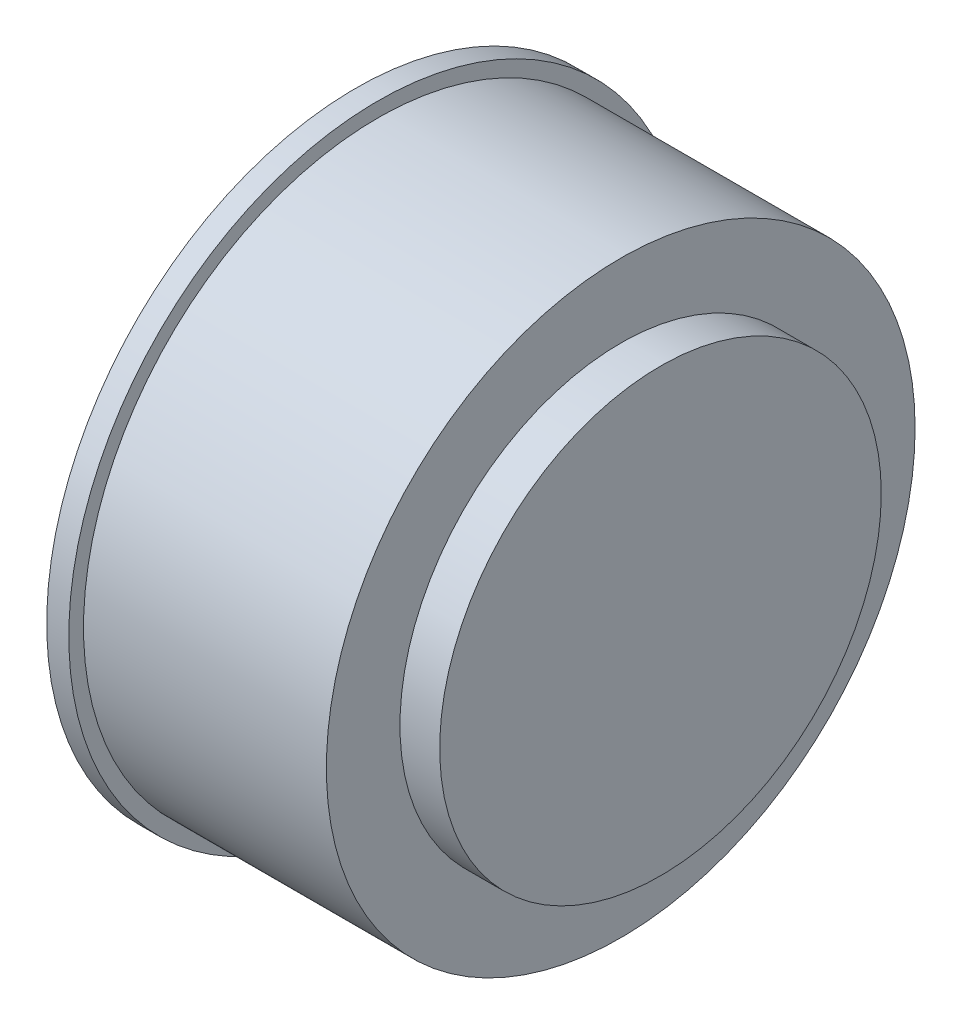
ISO-10303-21;
HEADER;
FILE_DESCRIPTION(('STEP AP214'),'2;1');
FILE_NAME('part.step','',(''),(''),'','','');
FILE_SCHEMA(('AUTOMOTIVE_DESIGN { 1 0 10303 214 1 1 1 1 }'));
ENDSEC;
DATA;
#1=APPLICATION_CONTEXT('core data for automotive mechanical design processes');
#2=APPLICATION_PROTOCOL_DEFINITION('international standard','automotive_design',2000,#1);
#3=PRODUCT_CONTEXT('',#1,'mechanical');
#4=PRODUCT('Part','Part','',(#3));
#5=PRODUCT_RELATED_PRODUCT_CATEGORY('part','',(#4));
#6=PRODUCT_DEFINITION_FORMATION('','',#4);
#7=PRODUCT_DEFINITION_CONTEXT('part definition',#1,'design');
#8=PRODUCT_DEFINITION('design','',#6,#7);
#9=PRODUCT_DEFINITION_SHAPE('','',#8);
#10=(LENGTH_UNIT() NAMED_UNIT(*) SI_UNIT(.MILLI.,.METRE.));
#11=(NAMED_UNIT(*) PLANE_ANGLE_UNIT() SI_UNIT($,.RADIAN.));
#12=(NAMED_UNIT(*) SI_UNIT($,.STERADIAN.) SOLID_ANGLE_UNIT());
#13=UNCERTAINTY_MEASURE_WITH_UNIT(LENGTH_MEASURE(1.E-05),#10,'distance_accuracy_value','');
#14=(GEOMETRIC_REPRESENTATION_CONTEXT(3) GLOBAL_UNCERTAINTY_ASSIGNED_CONTEXT((#13)) GLOBAL_UNIT_ASSIGNED_CONTEXT((#10,
#11,#12)) REPRESENTATION_CONTEXT('',''));
#15=CARTESIAN_POINT('',(0.,0.,0.));
#16=DIRECTION('',(0.,0.,1.));
#17=DIRECTION('',(1.,0.,0.));
#18=AXIS2_PLACEMENT_3D('',#15,#16,#17);
#19=CARTESIAN_POINT('',(0.,0.,0.));
#20=DIRECTION('',(1.,0.,0.));
#21=DIRECTION('',(0.,0.,-1.));
#22=AXIS2_PLACEMENT_3D('',#19,#20,#21);
#23=PLANE('',#22);
#24=CARTESIAN_POINT('',(0.,0.,0.));
#25=DIRECTION('',(1.,0.,0.));
#26=DIRECTION('',(0.,0.,-1.));
#27=AXIS2_PLACEMENT_3D('',#24,#25,#26);
#28=CIRCLE('',#27,15.);
#29=CARTESIAN_POINT('',(0.,0.,-15.));
#30=VERTEX_POINT('',#29);
#31=EDGE_CURVE('E10',#30,#30,#28,.T.);
#32=ORIENTED_EDGE('',*,*,#31,.T.);
#33=EDGE_LOOP('',(#32));
#34=FACE_BOUND('',#33,.T.);
#35=ADVANCED_FACE('F43',(#34),#23,.T.);
#36=CARTESIAN_POINT('',(0.,0.,0.));
#37=DIRECTION('',(1.,0.,0.));
#38=DIRECTION('',(0.,0.,-1.));
#39=AXIS2_PLACEMENT_3D('',#36,#37,#38);
#40=CYLINDRICAL_SURFACE('',#39,15.);
#41=CARTESIAN_POINT('',(-2.7,0.,0.));
#42=DIRECTION('',(1.,0.,0.));
#43=DIRECTION('',(0.,0.,-1.));
#44=AXIS2_PLACEMENT_3D('',#41,#42,#43);
#45=CIRCLE('',#44,15.);
#46=CARTESIAN_POINT('',(-2.7,0.,-15.));
#47=VERTEX_POINT('',#46);
#48=EDGE_CURVE('E50',#47,#47,#45,.T.);
#49=ORIENTED_EDGE('',*,*,#48,.T.);
#50=EDGE_LOOP('',(#49));
#51=FACE_BOUND('',#50,.T.);
#52=ORIENTED_EDGE('',*,*,#31,.F.);
#53=EDGE_LOOP('',(#52));
#54=FACE_BOUND('',#53,.T.);
#55=ADVANCED_FACE('F188',(#51,#54),#40,.T.);
#56=CARTESIAN_POINT('',(-2.7,0.,-15.));
#57=DIRECTION('',(1.,0.,0.));
#58=DIRECTION('',(0.,0.,-1.));
#59=AXIS2_PLACEMENT_3D('',#56,#57,#58);
#60=PLANE('',#59);
#61=CARTESIAN_POINT('',(-2.7,0.,0.));
#62=DIRECTION('',(1.,0.,0.));
#63=DIRECTION('',(0.,0.,-1.));
#64=AXIS2_PLACEMENT_3D('',#61,#62,#63);
#65=CIRCLE('',#64,20.);
#66=CARTESIAN_POINT('',(-2.7,0.,-20.));
#67=VERTEX_POINT('',#66);
#68=EDGE_CURVE('E55',#67,#67,#65,.T.);
#69=ORIENTED_EDGE('',*,*,#68,.T.);
#70=EDGE_LOOP('',(#69));
#71=FACE_BOUND('',#70,.T.);
#72=ORIENTED_EDGE('',*,*,#48,.F.);
#73=EDGE_LOOP('',(#72));
#74=FACE_BOUND('',#73,.T.);
#75=ADVANCED_FACE('F182',(#71,#74),#60,.T.);
#76=CARTESIAN_POINT('',(0.,0.,0.));
#77=DIRECTION('',(1.,0.,0.));
#78=DIRECTION('',(0.,0.,-1.));
#79=AXIS2_PLACEMENT_3D('',#76,#77,#78);
#80=CYLINDRICAL_SURFACE('',#79,20.);
#81=CARTESIAN_POINT('',(-19.2,0.,0.));
#82=DIRECTION('',(1.,0.,0.));
#83=DIRECTION('',(0.,0.,-1.));
#84=AXIS2_PLACEMENT_3D('',#81,#82,#83);
#85=CIRCLE('',#84,20.);
#86=CARTESIAN_POINT('',(-19.2,0.,-20.));
#87=VERTEX_POINT('',#86);
#88=EDGE_CURVE('E60',#87,#87,#85,.T.);
#89=ORIENTED_EDGE('',*,*,#88,.T.);
#90=EDGE_LOOP('',(#89));
#91=FACE_BOUND('',#90,.T.);
#92=ORIENTED_EDGE('',*,*,#68,.F.);
#93=EDGE_LOOP('',(#92));
#94=FACE_BOUND('',#93,.T.);
#95=ADVANCED_FACE('F176',(#91,#94),#80,.T.);
#96=CARTESIAN_POINT('',(-19.2,0.,-20.));
#97=DIRECTION('',(1.,0.,0.));
#98=DIRECTION('',(0.,0.,-1.));
#99=AXIS2_PLACEMENT_3D('',#96,#97,#98);
#100=PLANE('',#99);
#101=CARTESIAN_POINT('',(-19.2,0.,0.));
#102=DIRECTION('',(1.,0.,0.));
#103=DIRECTION('',(0.,0.,-1.));
#104=AXIS2_PLACEMENT_3D('',#101,#102,#103);
#105=CIRCLE('',#104,21.);
#106=CARTESIAN_POINT('',(-19.2,0.,-21.));
#107=VERTEX_POINT('',#106);
#108=EDGE_CURVE('E66',#107,#107,#105,.T.);
#109=ORIENTED_EDGE('',*,*,#108,.T.);
#110=EDGE_LOOP('',(#109));
#111=FACE_BOUND('',#110,.T.);
#112=ORIENTED_EDGE('',*,*,#88,.F.);
#113=EDGE_LOOP('',(#112));
#114=FACE_BOUND('',#113,.T.);
#115=ADVANCED_FACE('F170',(#111,#114),#100,.T.);
#116=CARTESIAN_POINT('',(0.,0.,0.));
#117=DIRECTION('',(1.,0.,0.));
#118=DIRECTION('',(0.,0.,-1.));
#119=AXIS2_PLACEMENT_3D('',#116,#117,#118);
#120=CYLINDRICAL_SURFACE('',#119,21.);
#121=CARTESIAN_POINT('',(-20.7,0.,0.));
#122=DIRECTION('',(1.,0.,0.));
#123=DIRECTION('',(0.,0.,-1.));
#124=AXIS2_PLACEMENT_3D('',#121,#122,#123);
#125=CIRCLE('',#124,21.);
#126=CARTESIAN_POINT('',(-20.7,0.,-21.));
#127=VERTEX_POINT('',#126);
#128=EDGE_CURVE('E70',#127,#127,#125,.T.);
#129=ORIENTED_EDGE('',*,*,#128,.T.);
#130=EDGE_LOOP('',(#129));
#131=FACE_BOUND('',#130,.T.);
#132=ORIENTED_EDGE('',*,*,#108,.F.);
#133=EDGE_LOOP('',(#132));
#134=FACE_BOUND('',#133,.T.);
#135=ADVANCED_FACE('F152',(#131,#134),#120,.T.);
#136=CARTESIAN_POINT('',(-20.7,0.,-14.5));
#137=DIRECTION('',(-1.,0.,0.));
#138=DIRECTION('',(0.,0.,1.));
#139=AXIS2_PLACEMENT_3D('',#136,#137,#138);
#140=PLANE('',#139);
#141=CARTESIAN_POINT('',(-20.7,16.,0.));
#142=DIRECTION('',(-1.,0.,0.));
#143=DIRECTION('',(0.,0.,1.));
#144=AXIS2_PLACEMENT_3D('',#141,#142,#143);
#145=CIRCLE('',#144,1.5);
#146=CARTESIAN_POINT('',(-20.7,16.,1.5));
#147=VERTEX_POINT('',#146);
#148=EDGE_CURVE('E124',#147,#147,#145,.T.);
#149=ORIENTED_EDGE('',*,*,#148,.F.);
#150=EDGE_LOOP('',(#149));
#151=FACE_BOUND('',#150,.T.);
#152=CARTESIAN_POINT('',(-20.7,8.04763509718006,-13.9389128690904));
#153=DIRECTION('',(-1.,0.,0.));
#154=DIRECTION('',(0.,0.,1.));
#155=AXIS2_PLACEMENT_3D('',#152,#153,#154);
#156=CIRCLE('',#155,1.5);
#157=CARTESIAN_POINT('',(-20.7,8.04763509718006,-12.4389128690904));
#158=VERTEX_POINT('',#157);
#159=EDGE_CURVE('E96',#158,#158,#156,.T.);
#160=ORIENTED_EDGE('',*,*,#159,.F.);
#161=EDGE_LOOP('',(#160));
#162=FACE_BOUND('',#161,.T.);
#163=CARTESIAN_POINT('',(-20.7,-8.00000000000001,-14.0214192776297));
#164=DIRECTION('',(-1.,0.,0.));
#165=DIRECTION('',(0.,0.,1.));
#166=AXIS2_PLACEMENT_3D('',#163,#164,#165);
#167=CIRCLE('',#166,1.5);
#168=CARTESIAN_POINT('',(-20.7,-8.00000000000001,-12.5214192776297));
#169=VERTEX_POINT('',#168);
#170=EDGE_CURVE('E95',#169,#169,#167,.T.);
#171=ORIENTED_EDGE('',*,*,#170,.F.);
#172=EDGE_LOOP('',(#171));
#173=FACE_BOUND('',#172,.T.);
#174=CARTESIAN_POINT('',(-20.7,-16.0952701943601,-0.165012817078659));
#175=DIRECTION('',(-1.,0.,0.));
#176=DIRECTION('',(0.,0.,1.));
#177=AXIS2_PLACEMENT_3D('',#174,#175,#176);
#178=CIRCLE('',#177,1.5);
#179=CARTESIAN_POINT('',(-20.7,-16.0952701943601,1.33498718292134));
#180=VERTEX_POINT('',#179);
#181=EDGE_CURVE('E104',#180,#180,#178,.T.);
#182=ORIENTED_EDGE('',*,*,#181,.F.);
#183=EDGE_LOOP('',(#182));
#184=FACE_BOUND('',#183,.T.);
#185=CARTESIAN_POINT('',(-20.7,-8.14290529154015,13.7739000520117));
#186=DIRECTION('',(-1.,0.,0.));
#187=DIRECTION('',(0.,0.,1.));
#188=AXIS2_PLACEMENT_3D('',#185,#186,#187);
#189=CIRCLE('',#188,1.5);
#190=CARTESIAN_POINT('',(-20.7,-8.14290529154015,15.2739000520117));
#191=VERTEX_POINT('',#190);
#192=EDGE_CURVE('E112',#191,#191,#189,.T.);
#193=ORIENTED_EDGE('',*,*,#192,.F.);
#194=EDGE_LOOP('',(#193));
#195=FACE_BOUND('',#194,.T.);
#196=CARTESIAN_POINT('',(-20.7,7.9047298056399,13.856406460551));
#197=DIRECTION('',(-1.,0.,0.));
#198=DIRECTION('',(0.,0.,1.));
#199=AXIS2_PLACEMENT_3D('',#196,#197,#198);
#200=CIRCLE('',#199,1.5);
#201=CARTESIAN_POINT('',(-20.7,7.9047298056399,15.356406460551));
#202=VERTEX_POINT('',#201);
#203=EDGE_CURVE('E120',#202,#202,#200,.T.);
#204=ORIENTED_EDGE('',*,*,#203,.F.);
#205=EDGE_LOOP('',(#204));
#206=FACE_BOUND('',#205,.T.);
#207=CARTESIAN_POINT('',(-20.7,0.,0.));
#208=DIRECTION('',(1.,0.,0.));
#209=DIRECTION('',(0.,0.,-1.));
#210=AXIS2_PLACEMENT_3D('',#207,#208,#209);
#211=CIRCLE('',#210,8.);
#212=CARTESIAN_POINT('',(-20.7,0.,-8.));
#213=VERTEX_POINT('',#212);
#214=EDGE_CURVE('E74',#213,#213,#211,.T.);
#215=ORIENTED_EDGE('',*,*,#214,.T.);
#216=EDGE_LOOP('',(#215));
#217=FACE_BOUND('',#216,.T.);
#218=ORIENTED_EDGE('',*,*,#128,.F.);
#219=EDGE_LOOP('',(#218));
#220=FACE_BOUND('',#219,.T.);
#221=ADVANCED_FACE('F148',(#151,#162,#173,#184,#195,#206,#217,#220),#140,.T.);
#222=CARTESIAN_POINT('',(0.,0.,0.));
#223=DIRECTION('',(1.,0.,0.));
#224=DIRECTION('',(0.,0.,-1.));
#225=AXIS2_PLACEMENT_3D('',#222,#223,#224);
#226=CYLINDRICAL_SURFACE('',#225,8.);
#227=CARTESIAN_POINT('',(-15.7,0.,0.));
#228=DIRECTION('',(1.,0.,0.));
#229=DIRECTION('',(0.,0.,-1.));
#230=AXIS2_PLACEMENT_3D('',#227,#228,#229);
#231=CIRCLE('',#230,8.);
#232=CARTESIAN_POINT('',(-15.7,0.,-8.));
#233=VERTEX_POINT('',#232);
#234=EDGE_CURVE('E78',#233,#233,#231,.T.);
#235=ORIENTED_EDGE('',*,*,#234,.T.);
#236=EDGE_LOOP('',(#235));
#237=FACE_BOUND('',#236,.T.);
#238=ORIENTED_EDGE('',*,*,#214,.F.);
#239=EDGE_LOOP('',(#238));
#240=FACE_BOUND('',#239,.T.);
#241=ADVANCED_FACE('F151',(#237,#240),#226,.F.);
#242=CARTESIAN_POINT('',(-15.7,0.,-8.));
#243=DIRECTION('',(-1.,0.,0.));
#244=DIRECTION('',(0.,0.,1.));
#245=AXIS2_PLACEMENT_3D('',#242,#243,#244);
#246=PLANE('',#245);
#247=CARTESIAN_POINT('',(-15.7,0.,0.));
#248=DIRECTION('',(1.,0.,0.));
#249=DIRECTION('',(0.,0.,-1.));
#250=AXIS2_PLACEMENT_3D('',#247,#248,#249);
#251=CIRCLE('',#250,6.);
#252=CARTESIAN_POINT('',(-15.7,0.,-6.));
#253=VERTEX_POINT('',#252);
#254=EDGE_CURVE('E82',#253,#253,#251,.T.);
#255=ORIENTED_EDGE('',*,*,#254,.T.);
#256=EDGE_LOOP('',(#255));
#257=FACE_BOUND('',#256,.T.);
#258=ORIENTED_EDGE('',*,*,#234,.F.);
#259=EDGE_LOOP('',(#258));
#260=FACE_BOUND('',#259,.T.);
#261=ADVANCED_FACE('F247',(#257,#260),#246,.T.);
#262=CARTESIAN_POINT('',(0.,0.,0.));
#263=DIRECTION('',(1.,0.,0.));
#264=DIRECTION('',(0.,0.,-1.));
#265=AXIS2_PLACEMENT_3D('',#262,#263,#264);
#266=CYLINDRICAL_SURFACE('',#265,6.);
#267=CARTESIAN_POINT('',(-14.7,0.,0.));
#268=DIRECTION('',(1.,0.,0.));
#269=DIRECTION('',(0.,0.,-1.));
#270=AXIS2_PLACEMENT_3D('',#267,#268,#269);
#271=CIRCLE('',#270,6.);
#272=CARTESIAN_POINT('',(-14.7,0.,-6.));
#273=VERTEX_POINT('',#272);
#274=EDGE_CURVE('E86',#273,#273,#271,.T.);
#275=ORIENTED_EDGE('',*,*,#274,.T.);
#276=EDGE_LOOP('',(#275));
#277=FACE_BOUND('',#276,.T.);
#278=ORIENTED_EDGE('',*,*,#254,.F.);
#279=EDGE_LOOP('',(#278));
#280=FACE_BOUND('',#279,.T.);
#281=ADVANCED_FACE('F257',(#277,#280),#266,.F.);
#282=CARTESIAN_POINT('',(-14.7,0.,-6.));
#283=DIRECTION('',(-1.,0.,0.));
#284=DIRECTION('',(0.,0.,1.));
#285=AXIS2_PLACEMENT_3D('',#282,#283,#284);
#286=PLANE('',#285);
#287=ORIENTED_EDGE('',*,*,#274,.F.);
#288=EDGE_LOOP('',(#287));
#289=FACE_BOUND('',#288,.T.);
#290=ADVANCED_FACE('F267',(#289),#286,.T.);
#291=CARTESIAN_POINT('',(-16.7,7.9047298056399,13.856406460551));
#292=DIRECTION('',(-1.,0.,0.));
#293=DIRECTION('',(0.,0.,1.));
#294=AXIS2_PLACEMENT_3D('',#291,#292,#293);
#295=CYLINDRICAL_SURFACE('',#294,1.5);
#296=CARTESIAN_POINT('',(-16.7,7.9047298056399,13.856406460551));
#297=DIRECTION('',(-1.,0.,0.));
#298=DIRECTION('',(0.,0.,1.));
#299=AXIS2_PLACEMENT_3D('',#296,#297,#298);
#300=CIRCLE('',#299,1.5);
#301=CARTESIAN_POINT('',(-16.7,7.9047298056399,15.356406460551));
#302=VERTEX_POINT('',#301);
#303=EDGE_CURVE('E116',#302,#302,#300,.T.);
#304=ORIENTED_EDGE('',*,*,#303,.F.);
#305=EDGE_LOOP('',(#304));
#306=FACE_BOUND('',#305,.T.);
#307=ORIENTED_EDGE('',*,*,#203,.T.);
#308=EDGE_LOOP('',(#307));
#309=FACE_BOUND('',#308,.T.);
#310=ADVANCED_FACE('F276',(#306,#309),#295,.F.);
#311=CARTESIAN_POINT('',(-16.7,7.9047298056399,13.856406460551));
#312=DIRECTION('',(-1.,0.,0.));
#313=DIRECTION('',(0.,0.,1.));
#314=AXIS2_PLACEMENT_3D('',#311,#312,#313);
#315=PLANE('',#314);
#316=ORIENTED_EDGE('',*,*,#303,.T.);
#317=EDGE_LOOP('',(#316));
#318=FACE_BOUND('',#317,.T.);
#319=ADVANCED_FACE('F285',(#318),#315,.T.);
#320=CARTESIAN_POINT('',(-16.7,-8.14290529154015,13.7739000520117));
#321=DIRECTION('',(-1.,0.,0.));
#322=DIRECTION('',(0.,0.,1.));
#323=AXIS2_PLACEMENT_3D('',#320,#321,#322);
#324=CYLINDRICAL_SURFACE('',#323,1.5);
#325=CARTESIAN_POINT('',(-16.7,-8.14290529154015,13.7739000520117));
#326=DIRECTION('',(-1.,0.,0.));
#327=DIRECTION('',(0.,0.,1.));
#328=AXIS2_PLACEMENT_3D('',#325,#326,#327);
#329=CIRCLE('',#328,1.5);
#330=CARTESIAN_POINT('',(-16.7,-8.14290529154015,15.2739000520117));
#331=VERTEX_POINT('',#330);
#332=EDGE_CURVE('E108',#331,#331,#329,.T.);
#333=ORIENTED_EDGE('',*,*,#332,.F.);
#334=EDGE_LOOP('',(#333));
#335=FACE_BOUND('',#334,.T.);
#336=ORIENTED_EDGE('',*,*,#192,.T.);
#337=EDGE_LOOP('',(#336));
#338=FACE_BOUND('',#337,.T.);
#339=ADVANCED_FACE('F295',(#335,#338),#324,.F.);
#340=CARTESIAN_POINT('',(-16.7,-8.14290529154015,13.7739000520117));
#341=DIRECTION('',(-1.,0.,0.));
#342=DIRECTION('',(0.,0.,1.));
#343=AXIS2_PLACEMENT_3D('',#340,#341,#342);
#344=PLANE('',#343);
#345=ORIENTED_EDGE('',*,*,#332,.T.);
#346=EDGE_LOOP('',(#345));
#347=FACE_BOUND('',#346,.T.);
#348=ADVANCED_FACE('F305',(#347),#344,.T.);
#349=CARTESIAN_POINT('',(-16.7,-16.0952701943601,-0.165012817078659));
#350=DIRECTION('',(-1.,0.,0.));
#351=DIRECTION('',(0.,0.,1.));
#352=AXIS2_PLACEMENT_3D('',#349,#350,#351);
#353=CYLINDRICAL_SURFACE('',#352,1.5);
#354=CARTESIAN_POINT('',(-16.7,-16.0952701943601,-0.165012817078659));
#355=DIRECTION('',(-1.,0.,0.));
#356=DIRECTION('',(0.,0.,1.));
#357=AXIS2_PLACEMENT_3D('',#354,#355,#356);
#358=CIRCLE('',#357,1.5);
#359=CARTESIAN_POINT('',(-16.7,-16.0952701943601,1.33498718292134));
#360=VERTEX_POINT('',#359);
#361=EDGE_CURVE('E100',#360,#360,#358,.T.);
#362=ORIENTED_EDGE('',*,*,#361,.F.);
#363=EDGE_LOOP('',(#362));
#364=FACE_BOUND('',#363,.T.);
#365=ORIENTED_EDGE('',*,*,#181,.T.);
#366=EDGE_LOOP('',(#365));
#367=FACE_BOUND('',#366,.T.);
#368=ADVANCED_FACE('F315',(#364,#367),#353,.F.);
#369=CARTESIAN_POINT('',(-16.7,-16.0952701943601,-0.165012817078659));
#370=DIRECTION('',(-1.,0.,0.));
#371=DIRECTION('',(0.,0.,1.));
#372=AXIS2_PLACEMENT_3D('',#369,#370,#371);
#373=PLANE('',#372);
#374=ORIENTED_EDGE('',*,*,#361,.T.);
#375=EDGE_LOOP('',(#374));
#376=FACE_BOUND('',#375,.T.);
#377=ADVANCED_FACE('F325',(#376),#373,.T.);
#378=CARTESIAN_POINT('',(-16.7,-8.00000000000001,-14.0214192776297));
#379=DIRECTION('',(-1.,0.,0.));
#380=DIRECTION('',(0.,0.,1.));
#381=AXIS2_PLACEMENT_3D('',#378,#379,#380);
#382=CYLINDRICAL_SURFACE('',#381,1.5);
#383=CARTESIAN_POINT('',(-16.7,-8.00000000000001,-14.0214192776297));
#384=DIRECTION('',(-1.,0.,0.));
#385=DIRECTION('',(0.,0.,1.));
#386=AXIS2_PLACEMENT_3D('',#383,#384,#385);
#387=CIRCLE('',#386,1.5);
#388=CARTESIAN_POINT('',(-16.7,-8.00000000000001,-12.5214192776297));
#389=VERTEX_POINT('',#388);
#390=EDGE_CURVE('E91',#389,#389,#387,.T.);
#391=ORIENTED_EDGE('',*,*,#390,.F.);
#392=EDGE_LOOP('',(#391));
#393=FACE_BOUND('',#392,.T.);
#394=ORIENTED_EDGE('',*,*,#170,.T.);
#395=EDGE_LOOP('',(#394));
#396=FACE_BOUND('',#395,.T.);
#397=ADVANCED_FACE('F335',(#393,#396),#382,.F.);
#398=CARTESIAN_POINT('',(-16.7,-8.00000000000001,-14.0214192776297));
#399=DIRECTION('',(-1.,0.,0.));
#400=DIRECTION('',(0.,0.,1.));
#401=AXIS2_PLACEMENT_3D('',#398,#399,#400);
#402=PLANE('',#401);
#403=ORIENTED_EDGE('',*,*,#390,.T.);
#404=EDGE_LOOP('',(#403));
#405=FACE_BOUND('',#404,.T.);
#406=ADVANCED_FACE('F345',(#405),#402,.T.);
#407=CARTESIAN_POINT('',(-16.7,8.04763509718006,-13.9389128690904));
#408=DIRECTION('',(-1.,0.,0.));
#409=DIRECTION('',(0.,0.,1.));
#410=AXIS2_PLACEMENT_3D('',#407,#408,#409);
#411=CYLINDRICAL_SURFACE('',#410,1.5);
#412=CARTESIAN_POINT('',(-16.7,8.04763509718006,-13.9389128690904));
#413=DIRECTION('',(-1.,0.,0.));
#414=DIRECTION('',(0.,0.,1.));
#415=AXIS2_PLACEMENT_3D('',#412,#413,#414);
#416=CIRCLE('',#415,1.5);
#417=CARTESIAN_POINT('',(-16.7,8.04763509718006,-12.4389128690904));
#418=VERTEX_POINT('',#417);
#419=EDGE_CURVE('E125',#418,#418,#416,.T.);
#420=ORIENTED_EDGE('',*,*,#419,.F.);
#421=EDGE_LOOP('',(#420));
#422=FACE_BOUND('',#421,.T.);
#423=ORIENTED_EDGE('',*,*,#159,.T.);
#424=EDGE_LOOP('',(#423));
#425=FACE_BOUND('',#424,.T.);
#426=ADVANCED_FACE('F355',(#422,#425),#411,.F.);
#427=CARTESIAN_POINT('',(-16.7,8.04763509718006,-13.9389128690904));
#428=DIRECTION('',(-1.,0.,0.));
#429=DIRECTION('',(0.,0.,1.));
#430=AXIS2_PLACEMENT_3D('',#427,#428,#429);
#431=PLANE('',#430);
#432=ORIENTED_EDGE('',*,*,#419,.T.);
#433=EDGE_LOOP('',(#432));
#434=FACE_BOUND('',#433,.T.);
#435=ADVANCED_FACE('F144',(#434),#431,.T.);
#436=CARTESIAN_POINT('',(-16.7,16.,0.));
#437=DIRECTION('',(-1.,0.,0.));
#438=DIRECTION('',(0.,0.,1.));
#439=AXIS2_PLACEMENT_3D('',#436,#437,#438);
#440=CYLINDRICAL_SURFACE('',#439,1.5);
#441=CARTESIAN_POINT('',(-16.7,16.,0.));
#442=DIRECTION('',(-1.,0.,0.));
#443=DIRECTION('',(0.,0.,1.));
#444=AXIS2_PLACEMENT_3D('',#441,#442,#443);
#445=CIRCLE('',#444,1.5);
#446=CARTESIAN_POINT('',(-16.7,16.,1.5));
#447=VERTEX_POINT('',#446);
#448=EDGE_CURVE('E90',#447,#447,#445,.T.);
#449=ORIENTED_EDGE('',*,*,#448,.F.);
#450=EDGE_LOOP('',(#449));
#451=FACE_BOUND('',#450,.T.);
#452=ORIENTED_EDGE('',*,*,#148,.T.);
#453=EDGE_LOOP('',(#452));
#454=FACE_BOUND('',#453,.T.);
#455=ADVANCED_FACE('F141',(#451,#454),#440,.F.);
#456=CARTESIAN_POINT('',(-16.7,16.,0.));
#457=DIRECTION('',(-1.,0.,0.));
#458=DIRECTION('',(0.,0.,1.));
#459=AXIS2_PLACEMENT_3D('',#456,#457,#458);
#460=PLANE('',#459);
#461=ORIENTED_EDGE('',*,*,#448,.T.);
#462=EDGE_LOOP('',(#461));
#463=FACE_BOUND('',#462,.T.);
#464=ADVANCED_FACE('F139',(#463),#460,.T.);
#465=CLOSED_SHELL('',(#35,#55,#75,#95,#115,#135,#221,#241,#261,#281,#290,#310,#319,#339,#348,
#368,#377,#397,#406,#426,#435,#455,#464));
#466=MANIFOLD_SOLID_BREP('B2',#465);
#467=ADVANCED_BREP_SHAPE_REPRESENTATION('',(#18,#466),#14);
#468=SHAPE_DEFINITION_REPRESENTATION(#9,#467);
ENDSEC;
END-ISO-10303-21;
